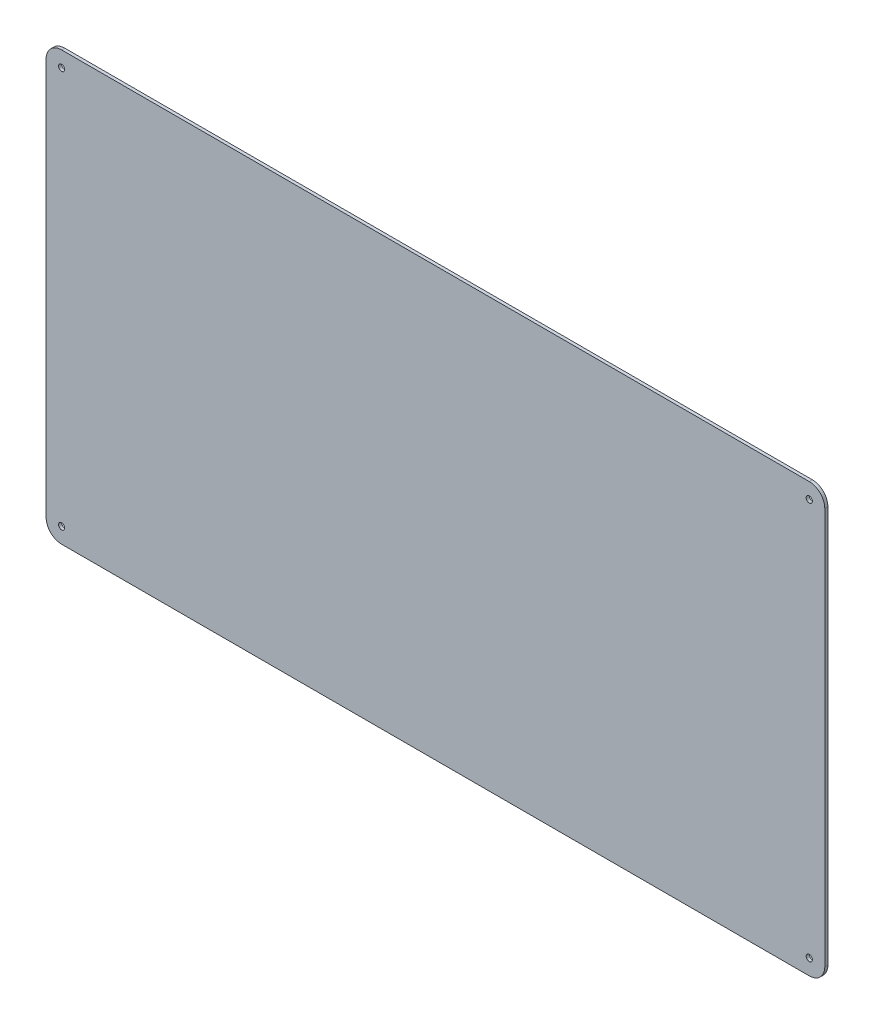
ISO-10303-21;
HEADER;
FILE_DESCRIPTION(('STEP AP214'),'2;1');
FILE_NAME('part.step','',(''),(''),'','','');
FILE_SCHEMA(('AUTOMOTIVE_DESIGN { 1 0 10303 214 1 1 1 1 }'));
ENDSEC;
DATA;
#1=APPLICATION_CONTEXT('core data for automotive mechanical design processes');
#2=APPLICATION_PROTOCOL_DEFINITION('international standard','automotive_design',2000,#1);
#3=PRODUCT_CONTEXT('',#1,'mechanical');
#4=PRODUCT('Part','Part','',(#3));
#5=PRODUCT_RELATED_PRODUCT_CATEGORY('part','',(#4));
#6=PRODUCT_DEFINITION_FORMATION('','',#4);
#7=PRODUCT_DEFINITION_CONTEXT('part definition',#1,'design');
#8=PRODUCT_DEFINITION('design','',#6,#7);
#9=PRODUCT_DEFINITION_SHAPE('','',#8);
#10=(LENGTH_UNIT() NAMED_UNIT(*) SI_UNIT(.MILLI.,.METRE.));
#11=(NAMED_UNIT(*) PLANE_ANGLE_UNIT() SI_UNIT($,.RADIAN.));
#12=(NAMED_UNIT(*) SI_UNIT($,.STERADIAN.) SOLID_ANGLE_UNIT());
#13=UNCERTAINTY_MEASURE_WITH_UNIT(LENGTH_MEASURE(1.E-05),#10,'distance_accuracy_value','');
#14=(GEOMETRIC_REPRESENTATION_CONTEXT(3) GLOBAL_UNCERTAINTY_ASSIGNED_CONTEXT((#13)) GLOBAL_UNIT_ASSIGNED_CONTEXT((#10,
#11,#12)) REPRESENTATION_CONTEXT('',''));
#15=CARTESIAN_POINT('',(0.,0.,0.));
#16=DIRECTION('',(0.,0.,1.));
#17=DIRECTION('',(1.,0.,0.));
#18=AXIS2_PLACEMENT_3D('',#15,#16,#17);
#19=CARTESIAN_POINT('',(246.,133.,-1.));
#20=DIRECTION('',(0.,0.,1.));
#21=DIRECTION('',(1.,0.,0.));
#22=AXIS2_PLACEMENT_3D('',#19,#20,#21);
#23=CYLINDRICAL_SURFACE('',#22,5.00000000000002);
#24=CARTESIAN_POINT('',(246.,133.,0.));
#25=DIRECTION('',(0.,0.,1.));
#26=DIRECTION('',(-1.,0.,0.));
#27=AXIS2_PLACEMENT_3D('',#24,#25,#26);
#28=CIRCLE('',#27,5.00000000000002);
#29=CARTESIAN_POINT('',(251.,133.,0.));
#30=VERTEX_POINT('',#29);
#31=CARTESIAN_POINT('',(246.,138.,0.));
#32=VERTEX_POINT('',#31);
#33=EDGE_CURVE('E135',#30,#32,#28,.T.);
#34=ORIENTED_EDGE('',*,*,#33,.F.);
#35=DIRECTION('',(0.,0.,1.));
#36=VECTOR('',#35,1.);
#37=CARTESIAN_POINT('',(251.,133.,-1.));
#38=LINE('',#37,#36);
#39=CARTESIAN_POINT('',(251.,133.,-1.));
#40=VERTEX_POINT('',#39);
#41=EDGE_CURVE('E11',#40,#30,#38,.T.);
#42=ORIENTED_EDGE('',*,*,#41,.F.);
#43=CARTESIAN_POINT('',(246.,133.,-1.));
#44=DIRECTION('',(0.,0.,1.));
#45=DIRECTION('',(-1.,0.,0.));
#46=AXIS2_PLACEMENT_3D('',#43,#44,#45);
#47=CIRCLE('',#46,5.00000000000002);
#48=CARTESIAN_POINT('',(246.,138.,-1.));
#49=VERTEX_POINT('',#48);
#50=EDGE_CURVE('E156',#40,#49,#47,.T.);
#51=ORIENTED_EDGE('',*,*,#50,.T.);
#52=DIRECTION('',(0.,0.,1.));
#53=VECTOR('',#52,1.);
#54=CARTESIAN_POINT('',(246.,138.,-1.));
#55=LINE('',#54,#53);
#56=EDGE_CURVE('E41',#49,#32,#55,.T.);
#57=ORIENTED_EDGE('',*,*,#56,.T.);
#58=EDGE_LOOP('',(#34,#42,#51,#57));
#59=FACE_BOUND('',#58,.T.);
#60=ADVANCED_FACE('F38',(#59),#23,.T.);
#61=CARTESIAN_POINT('',(251.,5.,-1.));
#62=DIRECTION('',(1.,0.,0.));
#63=DIRECTION('',(0.,0.,-1.));
#64=AXIS2_PLACEMENT_3D('',#61,#62,#63);
#65=PLANE('',#64);
#66=DIRECTION('',(0.,1.,0.));
#67=VECTOR('',#66,1.);
#68=CARTESIAN_POINT('',(251.,5.,0.));
#69=LINE('',#68,#67);
#70=CARTESIAN_POINT('',(251.,5.,0.));
#71=VERTEX_POINT('',#70);
#72=EDGE_CURVE('E154',#71,#30,#69,.T.);
#73=ORIENTED_EDGE('',*,*,#72,.F.);
#74=DIRECTION('',(0.,0.,1.));
#75=VECTOR('',#74,1.);
#76=CARTESIAN_POINT('',(251.,5.,-1.));
#77=LINE('',#76,#75);
#78=CARTESIAN_POINT('',(251.,5.,-1.));
#79=VERTEX_POINT('',#78);
#80=EDGE_CURVE('E47',#79,#71,#77,.T.);
#81=ORIENTED_EDGE('',*,*,#80,.F.);
#82=DIRECTION('',(0.,1.,0.));
#83=VECTOR('',#82,1.);
#84=CARTESIAN_POINT('',(251.,5.,-1.));
#85=LINE('',#84,#83);
#86=EDGE_CURVE('E125',#79,#40,#85,.T.);
#87=ORIENTED_EDGE('',*,*,#86,.T.);
#88=ORIENTED_EDGE('',*,*,#41,.T.);
#89=EDGE_LOOP('',(#73,#81,#87,#88));
#90=FACE_BOUND('',#89,.T.);
#91=ADVANCED_FACE('F168',(#90),#65,.T.);
#92=CARTESIAN_POINT('',(246.,5.,-1.));
#93=DIRECTION('',(0.,0.,1.));
#94=DIRECTION('',(1.,0.,0.));
#95=AXIS2_PLACEMENT_3D('',#92,#93,#94);
#96=CYLINDRICAL_SURFACE('',#95,5.);
#97=CARTESIAN_POINT('',(246.,5.,0.));
#98=DIRECTION('',(0.,0.,1.));
#99=DIRECTION('',(-1.,0.,0.));
#100=AXIS2_PLACEMENT_3D('',#97,#98,#99);
#101=CIRCLE('',#100,5.);
#102=CARTESIAN_POINT('',(246.,0.,0.));
#103=VERTEX_POINT('',#102);
#104=EDGE_CURVE('E112',#103,#71,#101,.T.);
#105=ORIENTED_EDGE('',*,*,#104,.F.);
#106=DIRECTION('',(0.,0.,1.));
#107=VECTOR('',#106,1.);
#108=CARTESIAN_POINT('',(246.,0.,-1.));
#109=LINE('',#108,#107);
#110=CARTESIAN_POINT('',(246.,0.,-1.));
#111=VERTEX_POINT('',#110);
#112=EDGE_CURVE('E107',#111,#103,#109,.T.);
#113=ORIENTED_EDGE('',*,*,#112,.F.);
#114=CARTESIAN_POINT('',(246.,5.,-1.));
#115=DIRECTION('',(0.,0.,1.));
#116=DIRECTION('',(-1.,0.,0.));
#117=AXIS2_PLACEMENT_3D('',#114,#115,#116);
#118=CIRCLE('',#117,5.);
#119=EDGE_CURVE('E110',#111,#79,#118,.T.);
#120=ORIENTED_EDGE('',*,*,#119,.T.);
#121=ORIENTED_EDGE('',*,*,#80,.T.);
#122=EDGE_LOOP('',(#105,#113,#120,#121));
#123=FACE_BOUND('',#122,.T.);
#124=ADVANCED_FACE('F109',(#123),#96,.T.);
#125=CARTESIAN_POINT('',(5.00000000000003,0.,-1.));
#126=DIRECTION('',(0.,-1.,0.));
#127=DIRECTION('',(0.,0.,-1.));
#128=AXIS2_PLACEMENT_3D('',#125,#126,#127);
#129=PLANE('',#128);
#130=DIRECTION('',(1.,0.,0.));
#131=VECTOR('',#130,1.);
#132=CARTESIAN_POINT('',(5.00000000000003,0.,0.));
#133=LINE('',#132,#131);
#134=CARTESIAN_POINT('',(5.00000000000003,0.,0.));
#135=VERTEX_POINT('',#134);
#136=EDGE_CURVE('E151',#135,#103,#133,.T.);
#137=ORIENTED_EDGE('',*,*,#136,.F.);
#138=DIRECTION('',(0.,0.,1.));
#139=VECTOR('',#138,1.);
#140=CARTESIAN_POINT('',(5.00000000000003,0.,-1.));
#141=LINE('',#140,#139);
#142=CARTESIAN_POINT('',(5.00000000000003,0.,-1.));
#143=VERTEX_POINT('',#142);
#144=EDGE_CURVE('E117',#143,#135,#141,.T.);
#145=ORIENTED_EDGE('',*,*,#144,.F.);
#146=DIRECTION('',(1.,0.,0.));
#147=VECTOR('',#146,1.);
#148=CARTESIAN_POINT('',(5.00000000000003,0.,-1.));
#149=LINE('',#148,#147);
#150=EDGE_CURVE('E123',#143,#111,#149,.T.);
#151=ORIENTED_EDGE('',*,*,#150,.T.);
#152=ORIENTED_EDGE('',*,*,#112,.T.);
#153=EDGE_LOOP('',(#137,#145,#151,#152));
#154=FACE_BOUND('',#153,.T.);
#155=ADVANCED_FACE('F127',(#154),#129,.T.);
#156=CARTESIAN_POINT('',(5.,5.,-1.));
#157=DIRECTION('',(0.,0.,1.));
#158=DIRECTION('',(1.,0.,0.));
#159=AXIS2_PLACEMENT_3D('',#156,#157,#158);
#160=CYLINDRICAL_SURFACE('',#159,5.);
#161=CARTESIAN_POINT('',(5.,5.,0.));
#162=DIRECTION('',(0.,0.,1.));
#163=DIRECTION('',(1.,0.,0.));
#164=AXIS2_PLACEMENT_3D('',#161,#162,#163);
#165=CIRCLE('',#164,5.);
#166=CARTESIAN_POINT('',(0.,5.00000000000004,0.));
#167=VERTEX_POINT('',#166);
#168=EDGE_CURVE('E148',#167,#135,#165,.T.);
#169=ORIENTED_EDGE('',*,*,#168,.F.);
#170=DIRECTION('',(0.,0.,1.));
#171=VECTOR('',#170,1.);
#172=CARTESIAN_POINT('',(0.,5.00000000000004,-1.));
#173=LINE('',#172,#171);
#174=CARTESIAN_POINT('',(0.,5.00000000000004,-1.));
#175=VERTEX_POINT('',#174);
#176=EDGE_CURVE('E160',#175,#167,#173,.T.);
#177=ORIENTED_EDGE('',*,*,#176,.F.);
#178=CARTESIAN_POINT('',(5.,5.,-1.));
#179=DIRECTION('',(0.,0.,1.));
#180=DIRECTION('',(1.,0.,0.));
#181=AXIS2_PLACEMENT_3D('',#178,#179,#180);
#182=CIRCLE('',#181,5.);
#183=EDGE_CURVE('E128',#175,#143,#182,.T.);
#184=ORIENTED_EDGE('',*,*,#183,.T.);
#185=ORIENTED_EDGE('',*,*,#144,.T.);
#186=EDGE_LOOP('',(#169,#177,#184,#185));
#187=FACE_BOUND('',#186,.T.);
#188=ADVANCED_FACE('F181',(#187),#160,.T.);
#189=CARTESIAN_POINT('',(0.,5.00000000000004,-1.));
#190=DIRECTION('',(-1.,0.,0.));
#191=DIRECTION('',(0.,-1.,0.));
#192=AXIS2_PLACEMENT_3D('',#189,#190,#191);
#193=PLANE('',#192);
#194=DIRECTION('',(0.,-1.,0.));
#195=VECTOR('',#194,1.);
#196=CARTESIAN_POINT('',(0.,5.00000000000004,0.));
#197=LINE('',#196,#195);
#198=CARTESIAN_POINT('',(0.,133.,0.));
#199=VERTEX_POINT('',#198);
#200=EDGE_CURVE('E145',#199,#167,#197,.T.);
#201=ORIENTED_EDGE('',*,*,#200,.F.);
#202=DIRECTION('',(0.,0.,1.));
#203=VECTOR('',#202,1.);
#204=CARTESIAN_POINT('',(0.,133.,-1.));
#205=LINE('',#204,#203);
#206=CARTESIAN_POINT('',(0.,133.,-1.));
#207=VERTEX_POINT('',#206);
#208=EDGE_CURVE('E162',#207,#199,#205,.T.);
#209=ORIENTED_EDGE('',*,*,#208,.F.);
#210=DIRECTION('',(0.,-1.,0.));
#211=VECTOR('',#210,1.);
#212=CARTESIAN_POINT('',(0.,5.00000000000004,-1.));
#213=LINE('',#212,#211);
#214=EDGE_CURVE('E130',#207,#175,#213,.T.);
#215=ORIENTED_EDGE('',*,*,#214,.T.);
#216=ORIENTED_EDGE('',*,*,#176,.T.);
#217=EDGE_LOOP('',(#201,#209,#215,#216));
#218=FACE_BOUND('',#217,.T.);
#219=ADVANCED_FACE('F184',(#218),#193,.T.);
#220=CARTESIAN_POINT('',(5.,133.,-1.));
#221=DIRECTION('',(0.,0.,1.));
#222=DIRECTION('',(1.,0.,0.));
#223=AXIS2_PLACEMENT_3D('',#220,#221,#222);
#224=CYLINDRICAL_SURFACE('',#223,5.);
#225=CARTESIAN_POINT('',(5.,133.,0.));
#226=DIRECTION('',(0.,0.,1.));
#227=DIRECTION('',(-1.,0.,0.));
#228=AXIS2_PLACEMENT_3D('',#225,#226,#227);
#229=CIRCLE('',#228,5.);
#230=CARTESIAN_POINT('',(5.,138.,0.));
#231=VERTEX_POINT('',#230);
#232=EDGE_CURVE('E142',#231,#199,#229,.T.);
#233=ORIENTED_EDGE('',*,*,#232,.F.);
#234=DIRECTION('',(0.,0.,1.));
#235=VECTOR('',#234,1.);
#236=CARTESIAN_POINT('',(5.,138.,-1.));
#237=LINE('',#236,#235);
#238=CARTESIAN_POINT('',(5.,138.,-1.));
#239=VERTEX_POINT('',#238);
#240=EDGE_CURVE('E163',#239,#231,#237,.T.);
#241=ORIENTED_EDGE('',*,*,#240,.F.);
#242=CARTESIAN_POINT('',(5.,133.,-1.));
#243=DIRECTION('',(0.,0.,1.));
#244=DIRECTION('',(-1.,0.,0.));
#245=AXIS2_PLACEMENT_3D('',#242,#243,#244);
#246=CIRCLE('',#245,5.);
#247=EDGE_CURVE('E250',#239,#207,#246,.T.);
#248=ORIENTED_EDGE('',*,*,#247,.T.);
#249=ORIENTED_EDGE('',*,*,#208,.T.);
#250=EDGE_LOOP('',(#233,#241,#248,#249));
#251=FACE_BOUND('',#250,.T.);
#252=ADVANCED_FACE('F188',(#251),#224,.T.);
#253=CARTESIAN_POINT('',(5.,138.,-1.));
#254=DIRECTION('',(0.,1.,0.));
#255=DIRECTION('',(0.,0.,1.));
#256=AXIS2_PLACEMENT_3D('',#253,#254,#255);
#257=PLANE('',#256);
#258=DIRECTION('',(-1.,0.,0.));
#259=VECTOR('',#258,1.);
#260=CARTESIAN_POINT('',(5.,138.,0.));
#261=LINE('',#260,#259);
#262=EDGE_CURVE('E138',#32,#231,#261,.T.);
#263=ORIENTED_EDGE('',*,*,#262,.F.);
#264=ORIENTED_EDGE('',*,*,#56,.F.);
#265=DIRECTION('',(-1.,0.,0.));
#266=VECTOR('',#265,1.);
#267=CARTESIAN_POINT('',(5.,138.,-1.));
#268=LINE('',#267,#266);
#269=EDGE_CURVE('E248',#49,#239,#268,.T.);
#270=ORIENTED_EDGE('',*,*,#269,.T.);
#271=ORIENTED_EDGE('',*,*,#240,.T.);
#272=EDGE_LOOP('',(#263,#264,#270,#271));
#273=FACE_BOUND('',#272,.T.);
#274=ADVANCED_FACE('F165',(#273),#257,.T.);
#275=CARTESIAN_POINT('',(246.,133.,-1.));
#276=DIRECTION('',(0.,0.,-1.));
#277=DIRECTION('',(-1.,0.,0.));
#278=AXIS2_PLACEMENT_3D('',#275,#276,#277);
#279=PLANE('',#278);
#280=CARTESIAN_POINT('',(246.,133.,-1.));
#281=DIRECTION('',(0.,0.,1.));
#282=DIRECTION('',(1.,0.,0.));
#283=AXIS2_PLACEMENT_3D('',#280,#281,#282);
#284=CIRCLE('',#283,0.999999999999998);
#285=CARTESIAN_POINT('',(247.,133.,-1.));
#286=VERTEX_POINT('',#285);
#287=EDGE_CURVE('E223',#286,#286,#284,.T.);
#288=ORIENTED_EDGE('',*,*,#287,.T.);
#289=EDGE_LOOP('',(#288));
#290=FACE_BOUND('',#289,.T.);
#291=CARTESIAN_POINT('',(246.,5.,-1.));
#292=DIRECTION('',(0.,0.,1.));
#293=DIRECTION('',(1.,0.,0.));
#294=AXIS2_PLACEMENT_3D('',#291,#292,#293);
#295=CIRCLE('',#294,0.999999999999998);
#296=CARTESIAN_POINT('',(247.,5.,-1.));
#297=VERTEX_POINT('',#296);
#298=EDGE_CURVE('E231',#297,#297,#295,.T.);
#299=ORIENTED_EDGE('',*,*,#298,.T.);
#300=EDGE_LOOP('',(#299));
#301=FACE_BOUND('',#300,.T.);
#302=CARTESIAN_POINT('',(5.,5.,-1.));
#303=DIRECTION('',(0.,0.,1.));
#304=DIRECTION('',(1.,0.,0.));
#305=AXIS2_PLACEMENT_3D('',#302,#303,#304);
#306=CIRCLE('',#305,1.);
#307=CARTESIAN_POINT('',(6.,5.,-1.));
#308=VERTEX_POINT('',#307);
#309=EDGE_CURVE('E237',#308,#308,#306,.T.);
#310=ORIENTED_EDGE('',*,*,#309,.T.);
#311=EDGE_LOOP('',(#310));
#312=FACE_BOUND('',#311,.T.);
#313=CARTESIAN_POINT('',(5.,133.,-1.));
#314=DIRECTION('',(0.,0.,1.));
#315=DIRECTION('',(1.,0.,0.));
#316=AXIS2_PLACEMENT_3D('',#313,#314,#315);
#317=CIRCLE('',#316,1.);
#318=CARTESIAN_POINT('',(6.,133.,-1.));
#319=VERTEX_POINT('',#318);
#320=EDGE_CURVE('E139',#319,#319,#317,.T.);
#321=ORIENTED_EDGE('',*,*,#320,.T.);
#322=EDGE_LOOP('',(#321));
#323=FACE_BOUND('',#322,.T.);
#324=ORIENTED_EDGE('',*,*,#50,.F.);
#325=ORIENTED_EDGE('',*,*,#86,.F.);
#326=ORIENTED_EDGE('',*,*,#119,.F.);
#327=ORIENTED_EDGE('',*,*,#150,.F.);
#328=ORIENTED_EDGE('',*,*,#183,.F.);
#329=ORIENTED_EDGE('',*,*,#214,.F.);
#330=ORIENTED_EDGE('',*,*,#247,.F.);
#331=ORIENTED_EDGE('',*,*,#269,.F.);
#332=EDGE_LOOP('',(#324,#325,#326,#327,#328,#329,#330,#331));
#333=FACE_BOUND('',#332,.T.);
#334=ADVANCED_FACE('F121',(#290,#301,#312,#323,#333),#279,.T.);
#335=CARTESIAN_POINT('',(246.,133.,0.));
#336=DIRECTION('',(0.,0.,-1.));
#337=DIRECTION('',(-1.,0.,0.));
#338=AXIS2_PLACEMENT_3D('',#335,#336,#337);
#339=PLANE('',#338);
#340=CARTESIAN_POINT('',(246.,133.,0.));
#341=DIRECTION('',(0.,0.,1.));
#342=DIRECTION('',(1.,0.,0.));
#343=AXIS2_PLACEMENT_3D('',#340,#341,#342);
#344=CIRCLE('',#343,0.999999999999998);
#345=CARTESIAN_POINT('',(247.,133.,0.));
#346=VERTEX_POINT('',#345);
#347=EDGE_CURVE('E226',#346,#346,#344,.T.);
#348=ORIENTED_EDGE('',*,*,#347,.F.);
#349=EDGE_LOOP('',(#348));
#350=FACE_BOUND('',#349,.T.);
#351=CARTESIAN_POINT('',(246.,5.,0.));
#352=DIRECTION('',(0.,0.,1.));
#353=DIRECTION('',(1.,0.,0.));
#354=AXIS2_PLACEMENT_3D('',#351,#352,#353);
#355=CIRCLE('',#354,0.999999999999998);
#356=CARTESIAN_POINT('',(247.,5.,0.));
#357=VERTEX_POINT('',#356);
#358=EDGE_CURVE('E228',#357,#357,#355,.T.);
#359=ORIENTED_EDGE('',*,*,#358,.F.);
#360=EDGE_LOOP('',(#359));
#361=FACE_BOUND('',#360,.T.);
#362=CARTESIAN_POINT('',(5.,5.,0.));
#363=DIRECTION('',(0.,0.,1.));
#364=DIRECTION('',(1.,0.,0.));
#365=AXIS2_PLACEMENT_3D('',#362,#363,#364);
#366=CIRCLE('',#365,1.);
#367=CARTESIAN_POINT('',(6.,5.,0.));
#368=VERTEX_POINT('',#367);
#369=EDGE_CURVE('E234',#368,#368,#366,.T.);
#370=ORIENTED_EDGE('',*,*,#369,.F.);
#371=EDGE_LOOP('',(#370));
#372=FACE_BOUND('',#371,.T.);
#373=CARTESIAN_POINT('',(5.,133.,0.));
#374=DIRECTION('',(0.,0.,1.));
#375=DIRECTION('',(1.,0.,0.));
#376=AXIS2_PLACEMENT_3D('',#373,#374,#375);
#377=CIRCLE('',#376,1.);
#378=CARTESIAN_POINT('',(6.,133.,0.));
#379=VERTEX_POINT('',#378);
#380=EDGE_CURVE('E240',#379,#379,#377,.T.);
#381=ORIENTED_EDGE('',*,*,#380,.F.);
#382=EDGE_LOOP('',(#381));
#383=FACE_BOUND('',#382,.T.);
#384=ORIENTED_EDGE('',*,*,#33,.T.);
#385=ORIENTED_EDGE('',*,*,#262,.T.);
#386=ORIENTED_EDGE('',*,*,#232,.T.);
#387=ORIENTED_EDGE('',*,*,#200,.T.);
#388=ORIENTED_EDGE('',*,*,#168,.T.);
#389=ORIENTED_EDGE('',*,*,#136,.T.);
#390=ORIENTED_EDGE('',*,*,#104,.T.);
#391=ORIENTED_EDGE('',*,*,#72,.T.);
#392=EDGE_LOOP('',(#384,#385,#386,#387,#388,#389,#390,#391));
#393=FACE_BOUND('',#392,.T.);
#394=ADVANCED_FACE('F167',(#350,#361,#372,#383,#393),#339,.F.);
#395=CARTESIAN_POINT('',(5.,133.,-1.));
#396=DIRECTION('',(0.,0.,1.));
#397=DIRECTION('',(1.,0.,0.));
#398=AXIS2_PLACEMENT_3D('',#395,#396,#397);
#399=CYLINDRICAL_SURFACE('',#398,1.);
#400=ORIENTED_EDGE('',*,*,#320,.F.);
#401=EDGE_LOOP('',(#400));
#402=FACE_BOUND('',#401,.T.);
#403=ORIENTED_EDGE('',*,*,#380,.T.);
#404=EDGE_LOOP('',(#403));
#405=FACE_BOUND('',#404,.T.);
#406=ADVANCED_FACE('F200',(#402,#405),#399,.F.);
#407=CARTESIAN_POINT('',(5.,5.,-1.));
#408=DIRECTION('',(0.,0.,1.));
#409=DIRECTION('',(1.,0.,0.));
#410=AXIS2_PLACEMENT_3D('',#407,#408,#409);
#411=CYLINDRICAL_SURFACE('',#410,1.);
#412=ORIENTED_EDGE('',*,*,#309,.F.);
#413=EDGE_LOOP('',(#412));
#414=FACE_BOUND('',#413,.T.);
#415=ORIENTED_EDGE('',*,*,#369,.T.);
#416=EDGE_LOOP('',(#415));
#417=FACE_BOUND('',#416,.T.);
#418=ADVANCED_FACE('F207',(#414,#417),#411,.F.);
#419=CARTESIAN_POINT('',(246.,5.,-1.));
#420=DIRECTION('',(0.,0.,1.));
#421=DIRECTION('',(1.,0.,0.));
#422=AXIS2_PLACEMENT_3D('',#419,#420,#421);
#423=CYLINDRICAL_SURFACE('',#422,0.999999999999998);
#424=ORIENTED_EDGE('',*,*,#298,.F.);
#425=EDGE_LOOP('',(#424));
#426=FACE_BOUND('',#425,.T.);
#427=ORIENTED_EDGE('',*,*,#358,.T.);
#428=EDGE_LOOP('',(#427));
#429=FACE_BOUND('',#428,.T.);
#430=ADVANCED_FACE('F211',(#426,#429),#423,.F.);
#431=CARTESIAN_POINT('',(246.,133.,-1.));
#432=DIRECTION('',(0.,0.,1.));
#433=DIRECTION('',(1.,0.,0.));
#434=AXIS2_PLACEMENT_3D('',#431,#432,#433);
#435=CYLINDRICAL_SURFACE('',#434,0.999999999999998);
#436=ORIENTED_EDGE('',*,*,#287,.F.);
#437=EDGE_LOOP('',(#436));
#438=FACE_BOUND('',#437,.T.);
#439=ORIENTED_EDGE('',*,*,#347,.T.);
#440=EDGE_LOOP('',(#439));
#441=FACE_BOUND('',#440,.T.);
#442=ADVANCED_FACE('F215',(#438,#441),#435,.F.);
#443=CLOSED_SHELL('',(#60,#91,#124,#155,#188,#219,#252,#274,#334,#394,#406,#418,#430,#442));
#444=MANIFOLD_SOLID_BREP('B2',#443);
#445=ADVANCED_BREP_SHAPE_REPRESENTATION('',(#18,#444),#14);
#446=SHAPE_DEFINITION_REPRESENTATION(#9,#445);
ENDSEC;
END-ISO-10303-21;
